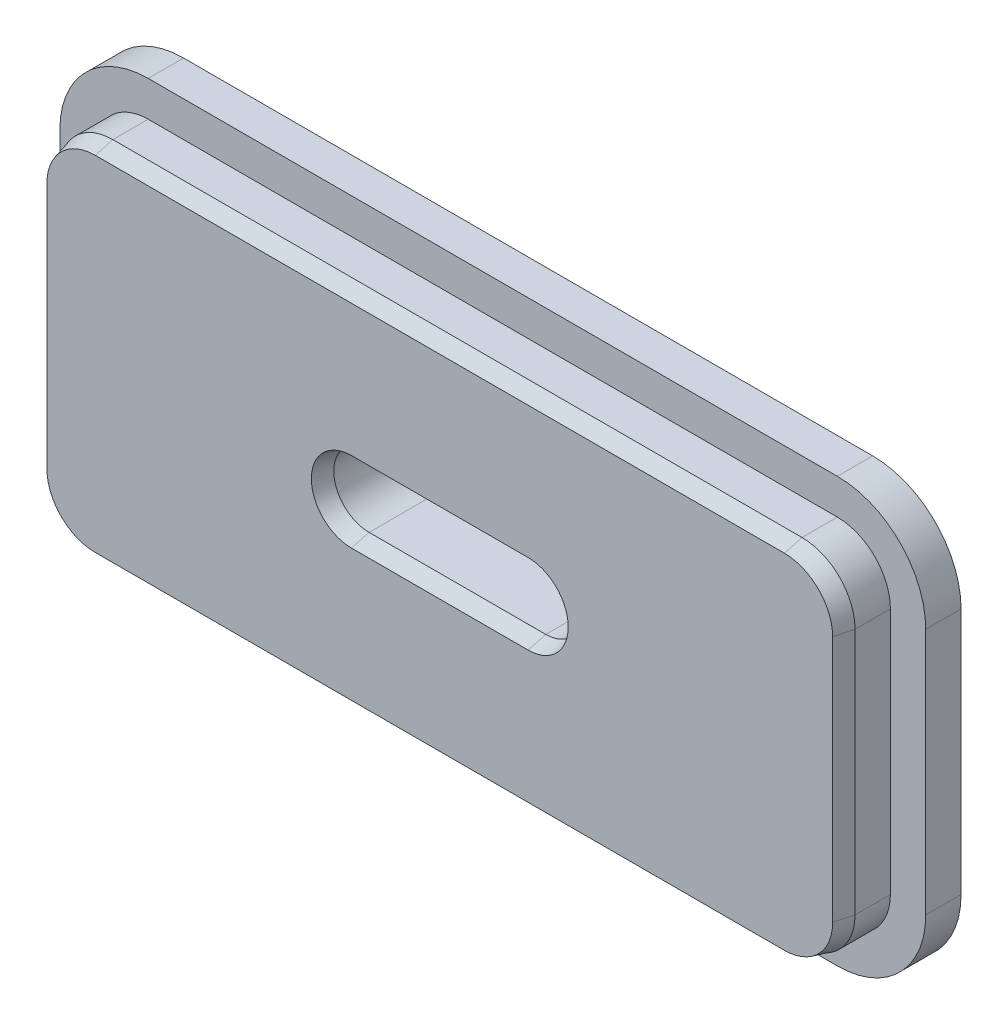
ISO-10303-21;
HEADER;
FILE_DESCRIPTION(('STEP AP214'),'2;1');
FILE_NAME('part.step','',(''),(''),'','','');
FILE_SCHEMA(('AUTOMOTIVE_DESIGN { 1 0 10303 214 1 1 1 1 }'));
ENDSEC;
DATA;
#1=APPLICATION_CONTEXT('core data for automotive mechanical design processes');
#2=APPLICATION_PROTOCOL_DEFINITION('international standard','automotive_design',2000,#1);
#3=PRODUCT_CONTEXT('',#1,'mechanical');
#4=PRODUCT('Part','Part','',(#3));
#5=PRODUCT_RELATED_PRODUCT_CATEGORY('part','',(#4));
#6=PRODUCT_DEFINITION_FORMATION('','',#4);
#7=PRODUCT_DEFINITION_CONTEXT('part definition',#1,'design');
#8=PRODUCT_DEFINITION('design','',#6,#7);
#9=PRODUCT_DEFINITION_SHAPE('','',#8);
#10=(LENGTH_UNIT() NAMED_UNIT(*) SI_UNIT(.MILLI.,.METRE.));
#11=(NAMED_UNIT(*) PLANE_ANGLE_UNIT() SI_UNIT($,.RADIAN.));
#12=(NAMED_UNIT(*) SI_UNIT($,.STERADIAN.) SOLID_ANGLE_UNIT());
#13=UNCERTAINTY_MEASURE_WITH_UNIT(LENGTH_MEASURE(1.E-05),#10,'distance_accuracy_value','');
#14=(GEOMETRIC_REPRESENTATION_CONTEXT(3) GLOBAL_UNCERTAINTY_ASSIGNED_CONTEXT((#13)) GLOBAL_UNIT_ASSIGNED_CONTEXT((#10,
#11,#12)) REPRESENTATION_CONTEXT('',''));
#15=CARTESIAN_POINT('',(0.,0.,0.));
#16=DIRECTION('',(0.,0.,1.));
#17=DIRECTION('',(1.,0.,0.));
#18=AXIS2_PLACEMENT_3D('',#15,#16,#17);
#19=CARTESIAN_POINT('',(-9.75,-3.5,2.));
#20=DIRECTION('',(0.,0.,-1.));
#21=DIRECTION('',(-1.,0.,0.));
#22=AXIS2_PLACEMENT_3D('',#19,#20,#21);
#23=CYLINDRICAL_SURFACE('',#22,1.5);
#24=CARTESIAN_POINT('',(-9.75,-3.5,1.));
#25=DIRECTION('',(0.,0.,-1.));
#26=DIRECTION('',(-1.,0.,0.));
#27=AXIS2_PLACEMENT_3D('',#24,#25,#26);
#28=CIRCLE('',#27,1.5);
#29=CARTESIAN_POINT('',(-9.75,-5.,1.));
#30=VERTEX_POINT('',#29);
#31=CARTESIAN_POINT('',(-11.25,-3.5,1.));
#32=VERTEX_POINT('',#31);
#33=EDGE_CURVE('E47',#30,#32,#28,.T.);
#34=ORIENTED_EDGE('',*,*,#33,.F.);
#35=DIRECTION('',(0.,0.,-1.));
#36=VECTOR('',#35,1.);
#37=CARTESIAN_POINT('',(-9.75,-5.,2.));
#38=LINE('',#37,#36);
#39=CARTESIAN_POINT('',(-9.75,-5.,2.));
#40=VERTEX_POINT('',#39);
#41=EDGE_CURVE('E11',#40,#30,#38,.T.);
#42=ORIENTED_EDGE('',*,*,#41,.F.);
#43=CARTESIAN_POINT('',(-9.75,-3.5,2.));
#44=DIRECTION('',(0.,0.,1.));
#45=DIRECTION('',(1.,0.,0.));
#46=AXIS2_PLACEMENT_3D('',#43,#44,#45);
#47=CIRCLE('',#46,1.5);
#48=CARTESIAN_POINT('',(-11.25,-3.5,2.));
#49=VERTEX_POINT('',#48);
#50=EDGE_CURVE('E376',#49,#40,#47,.T.);
#51=ORIENTED_EDGE('',*,*,#50,.F.);
#52=DIRECTION('',(0.,0.,-1.));
#53=VECTOR('',#52,1.);
#54=CARTESIAN_POINT('',(-11.25,-3.5,2.));
#55=LINE('',#54,#53);
#56=EDGE_CURVE('E400',#49,#32,#55,.T.);
#57=ORIENTED_EDGE('',*,*,#56,.T.);
#58=EDGE_LOOP('',(#34,#42,#51,#57));
#59=FACE_BOUND('',#58,.T.);
#60=ADVANCED_FACE('F33',(#59),#23,.T.);
#61=CARTESIAN_POINT('',(-9.75,-5.,2.));
#62=DIRECTION('',(0.,1.,0.));
#63=DIRECTION('',(-1.,0.,0.));
#64=AXIS2_PLACEMENT_3D('',#61,#62,#63);
#65=PLANE('',#64);
#66=DIRECTION('',(-1.,0.,0.));
#67=VECTOR('',#66,1.);
#68=CARTESIAN_POINT('',(9.75,-5.,1.));
#69=LINE('',#68,#67);
#70=CARTESIAN_POINT('',(9.75,-5.,1.));
#71=VERTEX_POINT('',#70);
#72=EDGE_CURVE('E53',#71,#30,#69,.T.);
#73=ORIENTED_EDGE('',*,*,#72,.F.);
#74=DIRECTION('',(0.,0.,-1.));
#75=VECTOR('',#74,1.);
#76=CARTESIAN_POINT('',(9.75,-5.,2.));
#77=LINE('',#76,#75);
#78=CARTESIAN_POINT('',(9.75,-5.,2.));
#79=VERTEX_POINT('',#78);
#80=EDGE_CURVE('E40',#79,#71,#77,.T.);
#81=ORIENTED_EDGE('',*,*,#80,.F.);
#82=DIRECTION('',(1.,0.,0.));
#83=VECTOR('',#82,1.);
#84=CARTESIAN_POINT('',(-9.75,-5.,2.));
#85=LINE('',#84,#83);
#86=EDGE_CURVE('E379',#40,#79,#85,.T.);
#87=ORIENTED_EDGE('',*,*,#86,.F.);
#88=ORIENTED_EDGE('',*,*,#41,.T.);
#89=EDGE_LOOP('',(#73,#81,#87,#88));
#90=FACE_BOUND('',#89,.T.);
#91=ADVANCED_FACE('F485',(#90),#65,.F.);
#92=CARTESIAN_POINT('',(9.75,-3.5,2.));
#93=DIRECTION('',(0.,0.,-1.));
#94=DIRECTION('',(-1.,0.,0.));
#95=AXIS2_PLACEMENT_3D('',#92,#93,#94);
#96=CYLINDRICAL_SURFACE('',#95,1.5);
#97=CARTESIAN_POINT('',(9.75,-3.5,1.));
#98=DIRECTION('',(0.,0.,-1.));
#99=DIRECTION('',(-1.,0.,0.));
#100=AXIS2_PLACEMENT_3D('',#97,#98,#99);
#101=CIRCLE('',#100,1.5);
#102=CARTESIAN_POINT('',(11.25,-3.5,1.));
#103=VERTEX_POINT('',#102);
#104=EDGE_CURVE('E419',#103,#71,#101,.T.);
#105=ORIENTED_EDGE('',*,*,#104,.F.);
#106=DIRECTION('',(0.,0.,-1.));
#107=VECTOR('',#106,1.);
#108=CARTESIAN_POINT('',(11.25,-3.5,2.));
#109=LINE('',#108,#107);
#110=CARTESIAN_POINT('',(11.25,-3.5,2.));
#111=VERTEX_POINT('',#110);
#112=EDGE_CURVE('E413',#111,#103,#109,.T.);
#113=ORIENTED_EDGE('',*,*,#112,.F.);
#114=CARTESIAN_POINT('',(9.75,-3.5,2.));
#115=DIRECTION('',(0.,0.,1.));
#116=DIRECTION('',(1.,0.,0.));
#117=AXIS2_PLACEMENT_3D('',#114,#115,#116);
#118=CIRCLE('',#117,1.5);
#119=EDGE_CURVE('E382',#79,#111,#118,.T.);
#120=ORIENTED_EDGE('',*,*,#119,.F.);
#121=ORIENTED_EDGE('',*,*,#80,.T.);
#122=EDGE_LOOP('',(#105,#113,#120,#121));
#123=FACE_BOUND('',#122,.T.);
#124=ADVANCED_FACE('F418',(#123),#96,.T.);
#125=CARTESIAN_POINT('',(11.25,3.5,2.));
#126=DIRECTION('',(-1.,0.,0.));
#127=DIRECTION('',(0.,-1.,0.));
#128=AXIS2_PLACEMENT_3D('',#125,#126,#127);
#129=PLANE('',#128);
#130=DIRECTION('',(0.,-1.,0.));
#131=VECTOR('',#130,1.);
#132=CARTESIAN_POINT('',(11.25,3.5,1.));
#133=LINE('',#132,#131);
#134=CARTESIAN_POINT('',(11.25,3.5,1.));
#135=VERTEX_POINT('',#134);
#136=EDGE_CURVE('E423',#135,#103,#133,.T.);
#137=ORIENTED_EDGE('',*,*,#136,.F.);
#138=DIRECTION('',(0.,0.,-1.));
#139=VECTOR('',#138,1.);
#140=CARTESIAN_POINT('',(11.25,3.5,2.));
#141=LINE('',#140,#139);
#142=CARTESIAN_POINT('',(11.25,3.5,2.));
#143=VERTEX_POINT('',#142);
#144=EDGE_CURVE('E410',#143,#135,#141,.T.);
#145=ORIENTED_EDGE('',*,*,#144,.F.);
#146=DIRECTION('',(0.,1.,0.));
#147=VECTOR('',#146,1.);
#148=CARTESIAN_POINT('',(11.25,3.5,2.));
#149=LINE('',#148,#147);
#150=EDGE_CURVE('E385',#111,#143,#149,.T.);
#151=ORIENTED_EDGE('',*,*,#150,.F.);
#152=ORIENTED_EDGE('',*,*,#112,.T.);
#153=EDGE_LOOP('',(#137,#145,#151,#152));
#154=FACE_BOUND('',#153,.T.);
#155=ADVANCED_FACE('F478',(#154),#129,.F.);
#156=CARTESIAN_POINT('',(9.75,3.5,2.));
#157=DIRECTION('',(0.,0.,-1.));
#158=DIRECTION('',(-1.,0.,0.));
#159=AXIS2_PLACEMENT_3D('',#156,#157,#158);
#160=CYLINDRICAL_SURFACE('',#159,1.5);
#161=CARTESIAN_POINT('',(9.75,3.5,1.));
#162=DIRECTION('',(0.,0.,-1.));
#163=DIRECTION('',(-1.,0.,0.));
#164=AXIS2_PLACEMENT_3D('',#161,#162,#163);
#165=CIRCLE('',#164,1.5);
#166=CARTESIAN_POINT('',(9.75,5.,1.));
#167=VERTEX_POINT('',#166);
#168=EDGE_CURVE('E424',#167,#135,#165,.T.);
#169=ORIENTED_EDGE('',*,*,#168,.F.);
#170=DIRECTION('',(0.,0.,-1.));
#171=VECTOR('',#170,1.);
#172=CARTESIAN_POINT('',(9.75,5.,2.));
#173=LINE('',#172,#171);
#174=CARTESIAN_POINT('',(9.75,5.,2.));
#175=VERTEX_POINT('',#174);
#176=EDGE_CURVE('E407',#175,#167,#173,.T.);
#177=ORIENTED_EDGE('',*,*,#176,.F.);
#178=CARTESIAN_POINT('',(9.75,3.5,2.));
#179=DIRECTION('',(0.,0.,1.));
#180=DIRECTION('',(-1.,0.,0.));
#181=AXIS2_PLACEMENT_3D('',#178,#179,#180);
#182=CIRCLE('',#181,1.5);
#183=EDGE_CURVE('E388',#143,#175,#182,.T.);
#184=ORIENTED_EDGE('',*,*,#183,.F.);
#185=ORIENTED_EDGE('',*,*,#144,.T.);
#186=EDGE_LOOP('',(#169,#177,#184,#185));
#187=FACE_BOUND('',#186,.T.);
#188=ADVANCED_FACE('F471',(#187),#160,.T.);
#189=CARTESIAN_POINT('',(-9.75,5.,2.));
#190=DIRECTION('',(0.,-1.,0.));
#191=DIRECTION('',(1.,0.,0.));
#192=AXIS2_PLACEMENT_3D('',#189,#190,#191);
#193=PLANE('',#192);
#194=DIRECTION('',(1.,0.,0.));
#195=VECTOR('',#194,1.);
#196=CARTESIAN_POINT('',(-9.75,5.,1.));
#197=LINE('',#196,#195);
#198=CARTESIAN_POINT('',(-9.75,5.,1.));
#199=VERTEX_POINT('',#198);
#200=EDGE_CURVE('E428',#199,#167,#197,.T.);
#201=ORIENTED_EDGE('',*,*,#200,.F.);
#202=DIRECTION('',(0.,0.,-1.));
#203=VECTOR('',#202,1.);
#204=CARTESIAN_POINT('',(-9.75,5.,2.));
#205=LINE('',#204,#203);
#206=CARTESIAN_POINT('',(-9.75,5.,2.));
#207=VERTEX_POINT('',#206);
#208=EDGE_CURVE('E404',#207,#199,#205,.T.);
#209=ORIENTED_EDGE('',*,*,#208,.F.);
#210=DIRECTION('',(-1.,0.,0.));
#211=VECTOR('',#210,1.);
#212=CARTESIAN_POINT('',(-9.75,5.,2.));
#213=LINE('',#212,#211);
#214=EDGE_CURVE('E391',#175,#207,#213,.T.);
#215=ORIENTED_EDGE('',*,*,#214,.F.);
#216=ORIENTED_EDGE('',*,*,#176,.T.);
#217=EDGE_LOOP('',(#201,#209,#215,#216));
#218=FACE_BOUND('',#217,.T.);
#219=ADVANCED_FACE('F464',(#218),#193,.F.);
#220=CARTESIAN_POINT('',(-9.75,3.5,2.));
#221=DIRECTION('',(0.,0.,-1.));
#222=DIRECTION('',(-1.,0.,0.));
#223=AXIS2_PLACEMENT_3D('',#220,#221,#222);
#224=CYLINDRICAL_SURFACE('',#223,1.5);
#225=CARTESIAN_POINT('',(-9.75,3.5,1.));
#226=DIRECTION('',(0.,0.,-1.));
#227=DIRECTION('',(-1.,0.,0.));
#228=AXIS2_PLACEMENT_3D('',#225,#226,#227);
#229=CIRCLE('',#228,1.5);
#230=CARTESIAN_POINT('',(-11.25,3.5,1.));
#231=VERTEX_POINT('',#230);
#232=EDGE_CURVE('E431',#231,#199,#229,.T.);
#233=ORIENTED_EDGE('',*,*,#232,.F.);
#234=DIRECTION('',(0.,0.,-1.));
#235=VECTOR('',#234,1.);
#236=CARTESIAN_POINT('',(-11.25,3.5,2.));
#237=LINE('',#236,#235);
#238=CARTESIAN_POINT('',(-11.25,3.5,2.));
#239=VERTEX_POINT('',#238);
#240=EDGE_CURVE('E402',#239,#231,#237,.T.);
#241=ORIENTED_EDGE('',*,*,#240,.F.);
#242=CARTESIAN_POINT('',(-9.75,3.5,2.));
#243=DIRECTION('',(0.,0.,1.));
#244=DIRECTION('',(1.,0.,0.));
#245=AXIS2_PLACEMENT_3D('',#242,#243,#244);
#246=CIRCLE('',#245,1.5);
#247=EDGE_CURVE('E394',#207,#239,#246,.T.);
#248=ORIENTED_EDGE('',*,*,#247,.F.);
#249=ORIENTED_EDGE('',*,*,#208,.T.);
#250=EDGE_LOOP('',(#233,#241,#248,#249));
#251=FACE_BOUND('',#250,.T.);
#252=ADVANCED_FACE('F457',(#251),#224,.T.);
#253=CARTESIAN_POINT('',(-11.25,3.5,2.));
#254=DIRECTION('',(1.,0.,0.));
#255=DIRECTION('',(0.,1.,0.));
#256=AXIS2_PLACEMENT_3D('',#253,#254,#255);
#257=PLANE('',#256);
#258=DIRECTION('',(0.,1.,0.));
#259=VECTOR('',#258,1.);
#260=CARTESIAN_POINT('',(-11.25,-3.5,1.));
#261=LINE('',#260,#259);
#262=EDGE_CURVE('E434',#32,#231,#261,.T.);
#263=ORIENTED_EDGE('',*,*,#262,.F.);
#264=ORIENTED_EDGE('',*,*,#56,.F.);
#265=DIRECTION('',(0.,-1.,0.));
#266=VECTOR('',#265,1.);
#267=CARTESIAN_POINT('',(-11.25,3.5,2.));
#268=LINE('',#267,#266);
#269=EDGE_CURVE('E397',#239,#49,#268,.T.);
#270=ORIENTED_EDGE('',*,*,#269,.F.);
#271=ORIENTED_EDGE('',*,*,#240,.T.);
#272=EDGE_LOOP('',(#263,#264,#270,#271));
#273=FACE_BOUND('',#272,.T.);
#274=ADVANCED_FACE('F440',(#273),#257,.F.);
#275=CARTESIAN_POINT('',(-9.75,-3.5,0.));
#276=DIRECTION('',(0.,0.,1.));
#277=DIRECTION('',(1.,0.,0.));
#278=AXIS2_PLACEMENT_3D('',#275,#276,#277);
#279=PLANE('',#278);
#280=CARTESIAN_POINT('',(-2.5,0.,0.));
#281=DIRECTION('',(0.,0.,1.));
#282=DIRECTION('',(1.,0.,0.));
#283=AXIS2_PLACEMENT_3D('',#280,#281,#282);
#284=CIRCLE('',#283,1.);
#285=CARTESIAN_POINT('',(-2.5,1.,0.));
#286=VERTEX_POINT('',#285);
#287=CARTESIAN_POINT('',(-2.5,-1.,0.));
#288=VERTEX_POINT('',#287);
#289=EDGE_CURVE('E287',#286,#288,#284,.T.);
#290=ORIENTED_EDGE('',*,*,#289,.T.);
#291=DIRECTION('',(1.,0.,0.));
#292=VECTOR('',#291,1.);
#293=CARTESIAN_POINT('',(-2.5,-1.,0.));
#294=LINE('',#293,#292);
#295=CARTESIAN_POINT('',(2.5,-1.,0.));
#296=VERTEX_POINT('',#295);
#297=EDGE_CURVE('E359',#288,#296,#294,.T.);
#298=ORIENTED_EDGE('',*,*,#297,.T.);
#299=CARTESIAN_POINT('',(2.5,0.,0.));
#300=DIRECTION('',(0.,0.,1.));
#301=DIRECTION('',(1.,0.,0.));
#302=AXIS2_PLACEMENT_3D('',#299,#300,#301);
#303=CIRCLE('',#302,1.);
#304=CARTESIAN_POINT('',(2.5,1.,0.));
#305=VERTEX_POINT('',#304);
#306=EDGE_CURVE('E362',#296,#305,#303,.T.);
#307=ORIENTED_EDGE('',*,*,#306,.T.);
#308=DIRECTION('',(-1.,0.,0.));
#309=VECTOR('',#308,1.);
#310=CARTESIAN_POINT('',(-2.5,1.,0.));
#311=LINE('',#310,#309);
#312=EDGE_CURVE('E347',#305,#286,#311,.T.);
#313=ORIENTED_EDGE('',*,*,#312,.T.);
#314=EDGE_LOOP('',(#290,#298,#307,#313));
#315=FACE_BOUND('',#314,.T.);
#316=CARTESIAN_POINT('',(-9.75,-3.5,0.));
#317=DIRECTION('',(0.,0.,-1.));
#318=DIRECTION('',(-1.,0.,0.));
#319=AXIS2_PLACEMENT_3D('',#316,#317,#318);
#320=CIRCLE('',#319,2.5);
#321=CARTESIAN_POINT('',(-9.75,-6.,0.));
#322=VERTEX_POINT('',#321);
#323=CARTESIAN_POINT('',(-12.25,-3.5,0.));
#324=VERTEX_POINT('',#323);
#325=EDGE_CURVE('E254',#322,#324,#320,.T.);
#326=ORIENTED_EDGE('',*,*,#325,.T.);
#327=DIRECTION('',(0.,1.,0.));
#328=VECTOR('',#327,1.);
#329=CARTESIAN_POINT('',(-12.25,-3.5,0.));
#330=LINE('',#329,#328);
#331=CARTESIAN_POINT('',(-12.25,3.5,0.));
#332=VERTEX_POINT('',#331);
#333=EDGE_CURVE('E211',#324,#332,#330,.T.);
#334=ORIENTED_EDGE('',*,*,#333,.T.);
#335=CARTESIAN_POINT('',(-9.75,3.5,0.));
#336=DIRECTION('',(0.,0.,-1.));
#337=DIRECTION('',(-1.,0.,0.));
#338=AXIS2_PLACEMENT_3D('',#335,#336,#337);
#339=CIRCLE('',#338,2.5);
#340=CARTESIAN_POINT('',(-9.75,6.,0.));
#341=VERTEX_POINT('',#340);
#342=EDGE_CURVE('E257',#332,#341,#339,.T.);
#343=ORIENTED_EDGE('',*,*,#342,.T.);
#344=DIRECTION('',(1.,0.,0.));
#345=VECTOR('',#344,1.);
#346=CARTESIAN_POINT('',(-9.75,6.,0.));
#347=LINE('',#346,#345);
#348=CARTESIAN_POINT('',(9.75,6.,0.));
#349=VERTEX_POINT('',#348);
#350=EDGE_CURVE('E260',#341,#349,#347,.T.);
#351=ORIENTED_EDGE('',*,*,#350,.T.);
#352=CARTESIAN_POINT('',(9.75,3.5,0.));
#353=DIRECTION('',(0.,0.,-1.));
#354=DIRECTION('',(-1.,0.,0.));
#355=AXIS2_PLACEMENT_3D('',#352,#353,#354);
#356=CIRCLE('',#355,2.5);
#357=CARTESIAN_POINT('',(12.25,3.5,0.));
#358=VERTEX_POINT('',#357);
#359=EDGE_CURVE('E263',#349,#358,#356,.T.);
#360=ORIENTED_EDGE('',*,*,#359,.T.);
#361=DIRECTION('',(0.,-1.,0.));
#362=VECTOR('',#361,1.);
#363=CARTESIAN_POINT('',(12.25,3.5,0.));
#364=LINE('',#363,#362);
#365=CARTESIAN_POINT('',(12.25,-3.5,0.));
#366=VERTEX_POINT('',#365);
#367=EDGE_CURVE('E266',#358,#366,#364,.T.);
#368=ORIENTED_EDGE('',*,*,#367,.T.);
#369=CARTESIAN_POINT('',(9.75,-3.5,0.));
#370=DIRECTION('',(0.,0.,-1.));
#371=DIRECTION('',(-1.,0.,0.));
#372=AXIS2_PLACEMENT_3D('',#369,#370,#371);
#373=CIRCLE('',#372,2.5);
#374=CARTESIAN_POINT('',(9.75,-6.,0.));
#375=VERTEX_POINT('',#374);
#376=EDGE_CURVE('E235',#366,#375,#373,.T.);
#377=ORIENTED_EDGE('',*,*,#376,.T.);
#378=DIRECTION('',(-1.,0.,0.));
#379=VECTOR('',#378,1.);
#380=CARTESIAN_POINT('',(9.75,-6.,0.));
#381=LINE('',#380,#379);
#382=EDGE_CURVE('E232',#375,#322,#381,.T.);
#383=ORIENTED_EDGE('',*,*,#382,.T.);
#384=EDGE_LOOP('',(#326,#334,#343,#351,#360,#368,#377,#383));
#385=FACE_BOUND('',#384,.T.);
#386=ADVANCED_FACE('F503',(#315,#385),#279,.F.);
#387=CARTESIAN_POINT('',(-2.5,0.,2.));
#388=DIRECTION('',(0.,0.,-1.));
#389=DIRECTION('',(-1.,0.,0.));
#390=AXIS2_PLACEMENT_3D('',#387,#388,#389);
#391=CYLINDRICAL_SURFACE('',#390,1.);
#392=ORIENTED_EDGE('',*,*,#289,.F.);
#393=DIRECTION('',(0.,0.,-1.));
#394=VECTOR('',#393,1.);
#395=CARTESIAN_POINT('',(-2.5,1.,2.));
#396=LINE('',#395,#394);
#397=CARTESIAN_POINT('',(-2.5,1.,2.));
#398=VERTEX_POINT('',#397);
#399=EDGE_CURVE('E356',#398,#286,#396,.T.);
#400=ORIENTED_EDGE('',*,*,#399,.F.);
#401=CARTESIAN_POINT('',(-2.5,0.,2.));
#402=DIRECTION('',(0.,0.,1.));
#403=DIRECTION('',(1.,0.,0.));
#404=AXIS2_PLACEMENT_3D('',#401,#402,#403);
#405=CIRCLE('',#404,1.);
#406=CARTESIAN_POINT('',(-2.5,-1.,2.));
#407=VERTEX_POINT('',#406);
#408=EDGE_CURVE('E343',#398,#407,#405,.T.);
#409=ORIENTED_EDGE('',*,*,#408,.T.);
#410=DIRECTION('',(0.,0.,-1.));
#411=VECTOR('',#410,1.);
#412=CARTESIAN_POINT('',(-2.5,-1.,2.));
#413=LINE('',#412,#411);
#414=EDGE_CURVE('E373',#407,#288,#413,.T.);
#415=ORIENTED_EDGE('',*,*,#414,.T.);
#416=EDGE_LOOP('',(#392,#400,#409,#415));
#417=FACE_BOUND('',#416,.T.);
#418=ADVANCED_FACE('F506',(#417),#391,.F.);
#419=CARTESIAN_POINT('',(-2.5,-1.,2.));
#420=DIRECTION('',(0.,1.,0.));
#421=DIRECTION('',(0.,0.,1.));
#422=AXIS2_PLACEMENT_3D('',#419,#420,#421);
#423=PLANE('',#422);
#424=ORIENTED_EDGE('',*,*,#297,.F.);
#425=ORIENTED_EDGE('',*,*,#414,.F.);
#426=DIRECTION('',(1.,0.,0.));
#427=VECTOR('',#426,1.);
#428=CARTESIAN_POINT('',(-2.5,-1.,2.));
#429=LINE('',#428,#427);
#430=CARTESIAN_POINT('',(2.5,-1.,2.));
#431=VERTEX_POINT('',#430);
#432=EDGE_CURVE('E346',#407,#431,#429,.T.);
#433=ORIENTED_EDGE('',*,*,#432,.T.);
#434=DIRECTION('',(0.,0.,-1.));
#435=VECTOR('',#434,1.);
#436=CARTESIAN_POINT('',(2.5,-1.,2.));
#437=LINE('',#436,#435);
#438=EDGE_CURVE('E371',#431,#296,#437,.T.);
#439=ORIENTED_EDGE('',*,*,#438,.T.);
#440=EDGE_LOOP('',(#424,#425,#433,#439));
#441=FACE_BOUND('',#440,.T.);
#442=ADVANCED_FACE('F510',(#441),#423,.T.);
#443=CARTESIAN_POINT('',(2.5,0.,2.));
#444=DIRECTION('',(0.,0.,-1.));
#445=DIRECTION('',(-1.,0.,0.));
#446=AXIS2_PLACEMENT_3D('',#443,#444,#445);
#447=CYLINDRICAL_SURFACE('',#446,1.);
#448=ORIENTED_EDGE('',*,*,#306,.F.);
#449=ORIENTED_EDGE('',*,*,#438,.F.);
#450=CARTESIAN_POINT('',(2.5,0.,2.));
#451=DIRECTION('',(0.,0.,1.));
#452=DIRECTION('',(1.,0.,0.));
#453=AXIS2_PLACEMENT_3D('',#450,#451,#452);
#454=CIRCLE('',#453,1.);
#455=CARTESIAN_POINT('',(2.5,1.,2.));
#456=VERTEX_POINT('',#455);
#457=EDGE_CURVE('E350',#431,#456,#454,.T.);
#458=ORIENTED_EDGE('',*,*,#457,.T.);
#459=DIRECTION('',(0.,0.,-1.));
#460=VECTOR('',#459,1.);
#461=CARTESIAN_POINT('',(2.5,1.,2.));
#462=LINE('',#461,#460);
#463=EDGE_CURVE('E369',#456,#305,#462,.T.);
#464=ORIENTED_EDGE('',*,*,#463,.T.);
#465=EDGE_LOOP('',(#448,#449,#458,#464));
#466=FACE_BOUND('',#465,.T.);
#467=ADVANCED_FACE('F514',(#466),#447,.F.);
#468=CARTESIAN_POINT('',(-2.5,1.,2.));
#469=DIRECTION('',(0.,-1.,0.));
#470=DIRECTION('',(1.,0.,0.));
#471=AXIS2_PLACEMENT_3D('',#468,#469,#470);
#472=PLANE('',#471);
#473=ORIENTED_EDGE('',*,*,#312,.F.);
#474=ORIENTED_EDGE('',*,*,#463,.F.);
#475=DIRECTION('',(-1.,0.,0.));
#476=VECTOR('',#475,1.);
#477=CARTESIAN_POINT('',(-2.5,1.,2.));
#478=LINE('',#477,#476);
#479=EDGE_CURVE('E353',#456,#398,#478,.T.);
#480=ORIENTED_EDGE('',*,*,#479,.T.);
#481=ORIENTED_EDGE('',*,*,#399,.T.);
#482=EDGE_LOOP('',(#473,#474,#480,#481));
#483=FACE_BOUND('',#482,.T.);
#484=ADVANCED_FACE('F518',(#483),#472,.T.);
#485=CARTESIAN_POINT('',(-9.75,-3.5,2.5));
#486=DIRECTION('',(0.,0.,1.));
#487=DIRECTION('',(1.,0.,0.));
#488=AXIS2_PLACEMENT_3D('',#485,#486,#487);
#489=PLANE('',#488);
#490=CARTESIAN_POINT('',(-9.75,-3.5,2.5));
#491=DIRECTION('',(0.,0.,1.));
#492=DIRECTION('',(1.,0.,0.));
#493=AXIS2_PLACEMENT_3D('',#490,#491,#492);
#494=CIRCLE('',#493,1.36602540378444);
#495=CARTESIAN_POINT('',(-11.1160254037844,-3.5,2.5));
#496=VERTEX_POINT('',#495);
#497=CARTESIAN_POINT('',(-9.75,-4.86602540378444,2.5));
#498=VERTEX_POINT('',#497);
#499=EDGE_CURVE('E310',#496,#498,#494,.T.);
#500=ORIENTED_EDGE('',*,*,#499,.T.);
#501=DIRECTION('',(-1.,0.,0.));
#502=VECTOR('',#501,1.);
#503=CARTESIAN_POINT('',(-9.75,-4.86602540378444,2.5));
#504=LINE('',#503,#502);
#505=CARTESIAN_POINT('',(9.75,-4.86602540378444,2.5));
#506=VERTEX_POINT('',#505);
#507=EDGE_CURVE('E313',#498,#506,#504,.F.);
#508=ORIENTED_EDGE('',*,*,#507,.T.);
#509=CARTESIAN_POINT('',(9.75,-3.5,2.5));
#510=DIRECTION('',(0.,0.,1.));
#511=DIRECTION('',(1.,0.,0.));
#512=AXIS2_PLACEMENT_3D('',#509,#510,#511);
#513=CIRCLE('',#512,1.36602540378444);
#514=CARTESIAN_POINT('',(11.1160254037844,-3.5,2.5));
#515=VERTEX_POINT('',#514);
#516=EDGE_CURVE('E316',#506,#515,#513,.T.);
#517=ORIENTED_EDGE('',*,*,#516,.T.);
#518=DIRECTION('',(0.,-1.,0.));
#519=VECTOR('',#518,1.);
#520=CARTESIAN_POINT('',(11.1160254037844,-3.5,2.5));
#521=LINE('',#520,#519);
#522=CARTESIAN_POINT('',(11.1160254037844,3.5,2.5));
#523=VERTEX_POINT('',#522);
#524=EDGE_CURVE('E318',#515,#523,#521,.F.);
#525=ORIENTED_EDGE('',*,*,#524,.T.);
#526=CARTESIAN_POINT('',(9.75,3.5,2.5));
#527=DIRECTION('',(0.,0.,1.));
#528=DIRECTION('',(1.,0.,0.));
#529=AXIS2_PLACEMENT_3D('',#526,#527,#528);
#530=CIRCLE('',#529,1.36602540378444);
#531=CARTESIAN_POINT('',(9.75,4.86602540378444,2.5));
#532=VERTEX_POINT('',#531);
#533=EDGE_CURVE('E320',#523,#532,#530,.T.);
#534=ORIENTED_EDGE('',*,*,#533,.T.);
#535=DIRECTION('',(1.,0.,0.));
#536=VECTOR('',#535,1.);
#537=CARTESIAN_POINT('',(9.75,4.86602540378444,2.5));
#538=LINE('',#537,#536);
#539=CARTESIAN_POINT('',(-9.75,4.86602540378444,2.5));
#540=VERTEX_POINT('',#539);
#541=EDGE_CURVE('E322',#532,#540,#538,.F.);
#542=ORIENTED_EDGE('',*,*,#541,.T.);
#543=CARTESIAN_POINT('',(-9.75,3.5,2.5));
#544=DIRECTION('',(0.,0.,1.));
#545=DIRECTION('',(1.,0.,0.));
#546=AXIS2_PLACEMENT_3D('',#543,#544,#545);
#547=CIRCLE('',#546,1.36602540378444);
#548=CARTESIAN_POINT('',(-11.1160254037844,3.5,2.5));
#549=VERTEX_POINT('',#548);
#550=EDGE_CURVE('E324',#540,#549,#547,.T.);
#551=ORIENTED_EDGE('',*,*,#550,.T.);
#552=DIRECTION('',(0.,1.,0.));
#553=VECTOR('',#552,1.);
#554=CARTESIAN_POINT('',(-11.1160254037844,3.5,2.5));
#555=LINE('',#554,#553);
#556=EDGE_CURVE('E293',#549,#496,#555,.F.);
#557=ORIENTED_EDGE('',*,*,#556,.T.);
#558=EDGE_LOOP('',(#500,#508,#517,#525,#534,#542,#551,#557));
#559=FACE_BOUND('',#558,.T.);
#560=DIRECTION('',(-1.,0.,0.));
#561=VECTOR('',#560,1.);
#562=CARTESIAN_POINT('',(2.5,1.13397459621556,2.5));
#563=LINE('',#562,#561);
#564=CARTESIAN_POINT('',(2.5,1.13397459621556,2.5));
#565=VERTEX_POINT('',#564);
#566=CARTESIAN_POINT('',(-2.5,1.13397459621556,2.5));
#567=VERTEX_POINT('',#566);
#568=EDGE_CURVE('E337',#565,#567,#563,.T.);
#569=ORIENTED_EDGE('',*,*,#568,.F.);
#570=CARTESIAN_POINT('',(2.5,0.,2.5));
#571=DIRECTION('',(0.,0.,1.));
#572=DIRECTION('',(1.,0.,0.));
#573=AXIS2_PLACEMENT_3D('',#570,#571,#572);
#574=CIRCLE('',#573,1.13397459621556);
#575=CARTESIAN_POINT('',(2.5,-1.13397459621556,2.5));
#576=VERTEX_POINT('',#575);
#577=EDGE_CURVE('E272',#576,#565,#574,.T.);
#578=ORIENTED_EDGE('',*,*,#577,.F.);
#579=DIRECTION('',(1.,0.,0.));
#580=VECTOR('',#579,1.);
#581=CARTESIAN_POINT('',(-2.5,-1.13397459621556,2.5));
#582=LINE('',#581,#580);
#583=CARTESIAN_POINT('',(-2.5,-1.13397459621556,2.5));
#584=VERTEX_POINT('',#583);
#585=EDGE_CURVE('E331',#584,#576,#582,.T.);
#586=ORIENTED_EDGE('',*,*,#585,.F.);
#587=CARTESIAN_POINT('',(-2.5,0.,2.5));
#588=DIRECTION('',(0.,0.,1.));
#589=DIRECTION('',(1.,0.,0.));
#590=AXIS2_PLACEMENT_3D('',#587,#588,#589);
#591=CIRCLE('',#590,1.13397459621556);
#592=EDGE_CURVE('E339',#567,#584,#591,.T.);
#593=ORIENTED_EDGE('',*,*,#592,.F.);
#594=EDGE_LOOP('',(#569,#578,#586,#593));
#595=FACE_BOUND('',#594,.T.);
#596=ADVANCED_FACE('F522',(#559,#595),#489,.T.);
#597=CARTESIAN_POINT('',(-9.75,-3.5,2.));
#598=DIRECTION('',(0.,0.,-1.));
#599=DIRECTION('',(1.,0.,0.));
#600=AXIS2_PLACEMENT_3D('',#597,#598,#599);
#601=CONICAL_SURFACE('',#600,1.5,0.26179938779915);
#602=ORIENTED_EDGE('',*,*,#50,.T.);
#603=DIRECTION('',(0.,-0.258819045102521,-0.965925826289068));
#604=VECTOR('',#603,1.);
#605=CARTESIAN_POINT('',(-9.75,-5.,2.));
#606=LINE('',#605,#604);
#607=EDGE_CURVE('E284',#498,#40,#606,.T.);
#608=ORIENTED_EDGE('',*,*,#607,.F.);
#609=ORIENTED_EDGE('',*,*,#499,.F.);
#610=DIRECTION('',(-0.258819045102521,0.,-0.965925826289068));
#611=VECTOR('',#610,1.);
#612=CARTESIAN_POINT('',(-11.25,-3.5,2.));
#613=LINE('',#612,#611);
#614=EDGE_CURVE('E289',#496,#49,#613,.T.);
#615=ORIENTED_EDGE('',*,*,#614,.T.);
#616=EDGE_LOOP('',(#602,#608,#609,#615));
#617=FACE_BOUND('',#616,.T.);
#618=ADVANCED_FACE('F444',(#617),#601,.T.);
#619=CARTESIAN_POINT('',(-9.75,-5.,2.));
#620=DIRECTION('',(0.,-0.965925826289068,0.258819045102521));
#621=DIRECTION('',(0.,-0.258819045102521,-0.965925826289068));
#622=AXIS2_PLACEMENT_3D('',#619,#620,#621);
#623=PLANE('',#622);
#624=ORIENTED_EDGE('',*,*,#86,.T.);
#625=DIRECTION('',(0.,-0.258819045102521,-0.965925826289068));
#626=VECTOR('',#625,1.);
#627=CARTESIAN_POINT('',(9.75,-5.,2.));
#628=LINE('',#627,#626);
#629=EDGE_CURVE('E288',#506,#79,#628,.T.);
#630=ORIENTED_EDGE('',*,*,#629,.F.);
#631=ORIENTED_EDGE('',*,*,#507,.F.);
#632=ORIENTED_EDGE('',*,*,#607,.T.);
#633=EDGE_LOOP('',(#624,#630,#631,#632));
#634=FACE_BOUND('',#633,.T.);
#635=ADVANCED_FACE('F484',(#634),#623,.T.);
#636=CARTESIAN_POINT('',(9.75,-3.5,2.));
#637=DIRECTION('',(0.,0.,-1.));
#638=DIRECTION('',(1.,0.,0.));
#639=AXIS2_PLACEMENT_3D('',#636,#637,#638);
#640=CONICAL_SURFACE('',#639,1.5,0.26179938779915);
#641=ORIENTED_EDGE('',*,*,#119,.T.);
#642=DIRECTION('',(0.258819045102521,0.,-0.965925826289068));
#643=VECTOR('',#642,1.);
#644=CARTESIAN_POINT('',(11.25,-3.5,2.));
#645=LINE('',#644,#643);
#646=EDGE_CURVE('E305',#515,#111,#645,.T.);
#647=ORIENTED_EDGE('',*,*,#646,.F.);
#648=ORIENTED_EDGE('',*,*,#516,.F.);
#649=ORIENTED_EDGE('',*,*,#629,.T.);
#650=EDGE_LOOP('',(#641,#647,#648,#649));
#651=FACE_BOUND('',#650,.T.);
#652=ADVANCED_FACE('F480',(#651),#640,.T.);
#653=CARTESIAN_POINT('',(11.25,-3.5,2.));
#654=DIRECTION('',(0.965925826289068,0.,0.258819045102521));
#655=DIRECTION('',(0.258819045102521,0.,-0.965925826289068));
#656=AXIS2_PLACEMENT_3D('',#653,#654,#655);
#657=PLANE('',#656);
#658=ORIENTED_EDGE('',*,*,#150,.T.);
#659=DIRECTION('',(0.258819045102521,0.,-0.965925826289068));
#660=VECTOR('',#659,1.);
#661=CARTESIAN_POINT('',(11.25,3.5,2.));
#662=LINE('',#661,#660);
#663=EDGE_CURVE('E302',#523,#143,#662,.T.);
#664=ORIENTED_EDGE('',*,*,#663,.F.);
#665=ORIENTED_EDGE('',*,*,#524,.F.);
#666=ORIENTED_EDGE('',*,*,#646,.T.);
#667=EDGE_LOOP('',(#658,#664,#665,#666));
#668=FACE_BOUND('',#667,.T.);
#669=ADVANCED_FACE('F474',(#668),#657,.T.);
#670=CARTESIAN_POINT('',(9.75,3.5,2.));
#671=DIRECTION('',(0.,0.,-1.));
#672=DIRECTION('',(1.,0.,0.));
#673=AXIS2_PLACEMENT_3D('',#670,#671,#672);
#674=CONICAL_SURFACE('',#673,1.5,0.26179938779915);
#675=ORIENTED_EDGE('',*,*,#183,.T.);
#676=DIRECTION('',(0.,0.258819045102521,-0.965925826289068));
#677=VECTOR('',#676,1.);
#678=CARTESIAN_POINT('',(9.75,5.,2.));
#679=LINE('',#678,#677);
#680=EDGE_CURVE('E299',#532,#175,#679,.T.);
#681=ORIENTED_EDGE('',*,*,#680,.F.);
#682=ORIENTED_EDGE('',*,*,#533,.F.);
#683=ORIENTED_EDGE('',*,*,#663,.T.);
#684=EDGE_LOOP('',(#675,#681,#682,#683));
#685=FACE_BOUND('',#684,.T.);
#686=ADVANCED_FACE('F467',(#685),#674,.T.);
#687=CARTESIAN_POINT('',(9.75,5.,2.));
#688=DIRECTION('',(0.,0.965925826289068,0.258819045102521));
#689=DIRECTION('',(0.,-0.258819045102521,0.965925826289068));
#690=AXIS2_PLACEMENT_3D('',#687,#688,#689);
#691=PLANE('',#690);
#692=ORIENTED_EDGE('',*,*,#214,.T.);
#693=DIRECTION('',(0.,0.258819045102521,-0.965925826289068));
#694=VECTOR('',#693,1.);
#695=CARTESIAN_POINT('',(-9.75,5.,2.));
#696=LINE('',#695,#694);
#697=EDGE_CURVE('E296',#540,#207,#696,.T.);
#698=ORIENTED_EDGE('',*,*,#697,.F.);
#699=ORIENTED_EDGE('',*,*,#541,.F.);
#700=ORIENTED_EDGE('',*,*,#680,.T.);
#701=EDGE_LOOP('',(#692,#698,#699,#700));
#702=FACE_BOUND('',#701,.T.);
#703=ADVANCED_FACE('F460',(#702),#691,.T.);
#704=CARTESIAN_POINT('',(-9.75,3.5,2.));
#705=DIRECTION('',(0.,0.,-1.));
#706=DIRECTION('',(1.,0.,0.));
#707=AXIS2_PLACEMENT_3D('',#704,#705,#706);
#708=CONICAL_SURFACE('',#707,1.5,0.26179938779915);
#709=ORIENTED_EDGE('',*,*,#247,.T.);
#710=DIRECTION('',(-0.258819045102521,0.,-0.965925826289068));
#711=VECTOR('',#710,1.);
#712=CARTESIAN_POINT('',(-11.25,3.5,2.));
#713=LINE('',#712,#711);
#714=EDGE_CURVE('E292',#549,#239,#713,.T.);
#715=ORIENTED_EDGE('',*,*,#714,.F.);
#716=ORIENTED_EDGE('',*,*,#550,.F.);
#717=ORIENTED_EDGE('',*,*,#697,.T.);
#718=EDGE_LOOP('',(#709,#715,#716,#717));
#719=FACE_BOUND('',#718,.T.);
#720=ADVANCED_FACE('F453',(#719),#708,.T.);
#721=CARTESIAN_POINT('',(-11.25,3.5,2.));
#722=DIRECTION('',(-0.965925826289068,0.,0.258819045102521));
#723=DIRECTION('',(0.258819045102521,0.,0.965925826289068));
#724=AXIS2_PLACEMENT_3D('',#721,#722,#723);
#725=PLANE('',#724);
#726=ORIENTED_EDGE('',*,*,#269,.T.);
#727=ORIENTED_EDGE('',*,*,#614,.F.);
#728=ORIENTED_EDGE('',*,*,#556,.F.);
#729=ORIENTED_EDGE('',*,*,#714,.T.);
#730=EDGE_LOOP('',(#726,#727,#728,#729));
#731=FACE_BOUND('',#730,.T.);
#732=ADVANCED_FACE('F449',(#731),#725,.T.);
#733=CARTESIAN_POINT('',(2.5,0.,2.));
#734=DIRECTION('',(0.,0.,1.));
#735=DIRECTION('',(1.,0.,0.));
#736=AXIS2_PLACEMENT_3D('',#733,#734,#735);
#737=CONICAL_SURFACE('',#736,1.,0.26179938779915);
#738=ORIENTED_EDGE('',*,*,#457,.F.);
#739=DIRECTION('',(0.,0.258819045102521,-0.965925826289068));
#740=VECTOR('',#739,1.);
#741=CARTESIAN_POINT('',(2.5,-1.,2.));
#742=LINE('',#741,#740);
#743=EDGE_CURVE('E327',#576,#431,#742,.T.);
#744=ORIENTED_EDGE('',*,*,#743,.F.);
#745=ORIENTED_EDGE('',*,*,#577,.T.);
#746=DIRECTION('',(0.,-0.258819045102521,-0.965925826289068));
#747=VECTOR('',#746,1.);
#748=CARTESIAN_POINT('',(2.5,1.,2.));
#749=LINE('',#748,#747);
#750=EDGE_CURVE('E314',#565,#456,#749,.T.);
#751=ORIENTED_EDGE('',*,*,#750,.T.);
#752=EDGE_LOOP('',(#738,#744,#745,#751));
#753=FACE_BOUND('',#752,.T.);
#754=ADVANCED_FACE('F535',(#753),#737,.F.);
#755=CARTESIAN_POINT('',(2.5,1.,2.));
#756=DIRECTION('',(0.,-0.965925826289068,0.258819045102521));
#757=DIRECTION('',(0.,-0.258819045102521,-0.965925826289068));
#758=AXIS2_PLACEMENT_3D('',#755,#756,#757);
#759=PLANE('',#758);
#760=ORIENTED_EDGE('',*,*,#479,.F.);
#761=ORIENTED_EDGE('',*,*,#750,.F.);
#762=ORIENTED_EDGE('',*,*,#568,.T.);
#763=DIRECTION('',(0.,-0.258819045102521,-0.965925826289068));
#764=VECTOR('',#763,1.);
#765=CARTESIAN_POINT('',(-2.5,1.,2.));
#766=LINE('',#765,#764);
#767=EDGE_CURVE('E333',#567,#398,#766,.T.);
#768=ORIENTED_EDGE('',*,*,#767,.T.);
#769=EDGE_LOOP('',(#760,#761,#762,#768));
#770=FACE_BOUND('',#769,.T.);
#771=ADVANCED_FACE('F531',(#770),#759,.T.);
#772=CARTESIAN_POINT('',(-2.5,0.,2.));
#773=DIRECTION('',(0.,0.,1.));
#774=DIRECTION('',(1.,0.,0.));
#775=AXIS2_PLACEMENT_3D('',#772,#773,#774);
#776=CONICAL_SURFACE('',#775,1.,0.26179938779915);
#777=ORIENTED_EDGE('',*,*,#408,.F.);
#778=ORIENTED_EDGE('',*,*,#767,.F.);
#779=ORIENTED_EDGE('',*,*,#592,.T.);
#780=DIRECTION('',(0.,0.258819045102521,-0.965925826289068));
#781=VECTOR('',#780,1.);
#782=CARTESIAN_POINT('',(-2.5,-1.,2.));
#783=LINE('',#782,#781);
#784=EDGE_CURVE('E330',#584,#407,#783,.T.);
#785=ORIENTED_EDGE('',*,*,#784,.T.);
#786=EDGE_LOOP('',(#777,#778,#779,#785));
#787=FACE_BOUND('',#786,.T.);
#788=ADVANCED_FACE('F527',(#787),#776,.F.);
#789=CARTESIAN_POINT('',(-2.5,-1.,2.));
#790=DIRECTION('',(0.,0.965925826289068,0.258819045102521));
#791=DIRECTION('',(0.,-0.258819045102521,0.965925826289068));
#792=AXIS2_PLACEMENT_3D('',#789,#790,#791);
#793=PLANE('',#792);
#794=ORIENTED_EDGE('',*,*,#432,.F.);
#795=ORIENTED_EDGE('',*,*,#784,.F.);
#796=ORIENTED_EDGE('',*,*,#585,.T.);
#797=ORIENTED_EDGE('',*,*,#743,.T.);
#798=EDGE_LOOP('',(#794,#795,#796,#797));
#799=FACE_BOUND('',#798,.T.);
#800=ADVANCED_FACE('F524',(#799),#793,.T.);
#801=CARTESIAN_POINT('',(-9.75,-3.5,1.));
#802=DIRECTION('',(0.,0.,-1.));
#803=DIRECTION('',(-1.,0.,0.));
#804=AXIS2_PLACEMENT_3D('',#801,#802,#803);
#805=CYLINDRICAL_SURFACE('',#804,2.5);
#806=ORIENTED_EDGE('',*,*,#325,.F.);
#807=DIRECTION('',(0.,0.,-1.));
#808=VECTOR('',#807,1.);
#809=CARTESIAN_POINT('',(-9.75,-6.,1.));
#810=LINE('',#809,#808);
#811=CARTESIAN_POINT('',(-9.75,-6.,1.));
#812=VERTEX_POINT('',#811);
#813=EDGE_CURVE('E231',#812,#322,#810,.T.);
#814=ORIENTED_EDGE('',*,*,#813,.F.);
#815=CARTESIAN_POINT('',(-9.75,-3.5,1.));
#816=DIRECTION('',(0.,0.,-1.));
#817=DIRECTION('',(-1.,0.,0.));
#818=AXIS2_PLACEMENT_3D('',#815,#816,#817);
#819=CIRCLE('',#818,2.5);
#820=CARTESIAN_POINT('',(-12.25,-3.5,1.));
#821=VERTEX_POINT('',#820);
#822=EDGE_CURVE('E224',#812,#821,#819,.T.);
#823=ORIENTED_EDGE('',*,*,#822,.T.);
#824=DIRECTION('',(0.,0.,-1.));
#825=VECTOR('',#824,1.);
#826=CARTESIAN_POINT('',(-12.25,-3.5,1.));
#827=LINE('',#826,#825);
#828=EDGE_CURVE('E206',#821,#324,#827,.T.);
#829=ORIENTED_EDGE('',*,*,#828,.T.);
#830=EDGE_LOOP('',(#806,#814,#823,#829));
#831=FACE_BOUND('',#830,.T.);
#832=ADVANCED_FACE('F230',(#831),#805,.T.);
#833=CARTESIAN_POINT('',(9.75,-6.,1.));
#834=DIRECTION('',(0.,-1.,0.));
#835=DIRECTION('',(1.,0.,0.));
#836=AXIS2_PLACEMENT_3D('',#833,#834,#835);
#837=PLANE('',#836);
#838=ORIENTED_EDGE('',*,*,#382,.F.);
#839=DIRECTION('',(0.,0.,-1.));
#840=VECTOR('',#839,1.);
#841=CARTESIAN_POINT('',(9.75,-6.,1.));
#842=LINE('',#841,#840);
#843=CARTESIAN_POINT('',(9.75,-6.,1.));
#844=VERTEX_POINT('',#843);
#845=EDGE_CURVE('E273',#844,#375,#842,.T.);
#846=ORIENTED_EDGE('',*,*,#845,.F.);
#847=DIRECTION('',(-1.,0.,0.));
#848=VECTOR('',#847,1.);
#849=CARTESIAN_POINT('',(9.75,-6.,1.));
#850=LINE('',#849,#848);
#851=EDGE_CURVE('E217',#844,#812,#850,.T.);
#852=ORIENTED_EDGE('',*,*,#851,.T.);
#853=ORIENTED_EDGE('',*,*,#813,.T.);
#854=EDGE_LOOP('',(#838,#846,#852,#853));
#855=FACE_BOUND('',#854,.T.);
#856=ADVANCED_FACE('F561',(#855),#837,.T.);
#857=CARTESIAN_POINT('',(9.75,-3.5,1.));
#858=DIRECTION('',(0.,0.,-1.));
#859=DIRECTION('',(-1.,0.,0.));
#860=AXIS2_PLACEMENT_3D('',#857,#858,#859);
#861=CYLINDRICAL_SURFACE('',#860,2.5);
#862=ORIENTED_EDGE('',*,*,#376,.F.);
#863=DIRECTION('',(0.,0.,-1.));
#864=VECTOR('',#863,1.);
#865=CARTESIAN_POINT('',(12.25,-3.5,1.));
#866=LINE('',#865,#864);
#867=CARTESIAN_POINT('',(12.25,-3.5,1.));
#868=VERTEX_POINT('',#867);
#869=EDGE_CURVE('E275',#868,#366,#866,.T.);
#870=ORIENTED_EDGE('',*,*,#869,.F.);
#871=CARTESIAN_POINT('',(9.75,-3.5,1.));
#872=DIRECTION('',(0.,0.,-1.));
#873=DIRECTION('',(-1.,0.,0.));
#874=AXIS2_PLACEMENT_3D('',#871,#872,#873);
#875=CIRCLE('',#874,2.5);
#876=EDGE_CURVE('E250',#868,#844,#875,.T.);
#877=ORIENTED_EDGE('',*,*,#876,.T.);
#878=ORIENTED_EDGE('',*,*,#845,.T.);
#879=EDGE_LOOP('',(#862,#870,#877,#878));
#880=FACE_BOUND('',#879,.T.);
#881=ADVANCED_FACE('F579',(#880),#861,.T.);
#882=CARTESIAN_POINT('',(12.25,3.5,1.));
#883=DIRECTION('',(1.,0.,0.));
#884=DIRECTION('',(0.,0.,-1.));
#885=AXIS2_PLACEMENT_3D('',#882,#883,#884);
#886=PLANE('',#885);
#887=ORIENTED_EDGE('',*,*,#367,.F.);
#888=DIRECTION('',(0.,0.,-1.));
#889=VECTOR('',#888,1.);
#890=CARTESIAN_POINT('',(12.25,3.5,1.));
#891=LINE('',#890,#889);
#892=CARTESIAN_POINT('',(12.25,3.5,1.));
#893=VERTEX_POINT('',#892);
#894=EDGE_CURVE('E277',#893,#358,#891,.T.);
#895=ORIENTED_EDGE('',*,*,#894,.F.);
#896=DIRECTION('',(0.,-1.,0.));
#897=VECTOR('',#896,1.);
#898=CARTESIAN_POINT('',(12.25,3.5,1.));
#899=LINE('',#898,#897);
#900=EDGE_CURVE('E247',#893,#868,#899,.T.);
#901=ORIENTED_EDGE('',*,*,#900,.T.);
#902=ORIENTED_EDGE('',*,*,#869,.T.);
#903=EDGE_LOOP('',(#887,#895,#901,#902));
#904=FACE_BOUND('',#903,.T.);
#905=ADVANCED_FACE('F575',(#904),#886,.T.);
#906=CARTESIAN_POINT('',(9.75,3.5,1.));
#907=DIRECTION('',(0.,0.,-1.));
#908=DIRECTION('',(-1.,0.,0.));
#909=AXIS2_PLACEMENT_3D('',#906,#907,#908);
#910=CYLINDRICAL_SURFACE('',#909,2.5);
#911=ORIENTED_EDGE('',*,*,#359,.F.);
#912=DIRECTION('',(0.,0.,-1.));
#913=VECTOR('',#912,1.);
#914=CARTESIAN_POINT('',(9.75,6.,1.));
#915=LINE('',#914,#913);
#916=CARTESIAN_POINT('',(9.75,6.,1.));
#917=VERTEX_POINT('',#916);
#918=EDGE_CURVE('E279',#917,#349,#915,.T.);
#919=ORIENTED_EDGE('',*,*,#918,.F.);
#920=CARTESIAN_POINT('',(9.75,3.5,1.));
#921=DIRECTION('',(0.,0.,-1.));
#922=DIRECTION('',(-1.,0.,0.));
#923=AXIS2_PLACEMENT_3D('',#920,#921,#922);
#924=CIRCLE('',#923,2.5);
#925=EDGE_CURVE('E244',#917,#893,#924,.T.);
#926=ORIENTED_EDGE('',*,*,#925,.T.);
#927=ORIENTED_EDGE('',*,*,#894,.T.);
#928=EDGE_LOOP('',(#911,#919,#926,#927));
#929=FACE_BOUND('',#928,.T.);
#930=ADVANCED_FACE('F571',(#929),#910,.T.);
#931=CARTESIAN_POINT('',(-9.75,6.,1.));
#932=DIRECTION('',(0.,1.,0.));
#933=DIRECTION('',(-1.,0.,0.));
#934=AXIS2_PLACEMENT_3D('',#931,#932,#933);
#935=PLANE('',#934);
#936=ORIENTED_EDGE('',*,*,#350,.F.);
#937=DIRECTION('',(0.,0.,-1.));
#938=VECTOR('',#937,1.);
#939=CARTESIAN_POINT('',(-9.75,6.,1.));
#940=LINE('',#939,#938);
#941=CARTESIAN_POINT('',(-9.75,6.,1.));
#942=VERTEX_POINT('',#941);
#943=EDGE_CURVE('E281',#942,#341,#940,.T.);
#944=ORIENTED_EDGE('',*,*,#943,.F.);
#945=DIRECTION('',(1.,0.,0.));
#946=VECTOR('',#945,1.);
#947=CARTESIAN_POINT('',(-9.75,6.,1.));
#948=LINE('',#947,#946);
#949=EDGE_CURVE('E241',#942,#917,#948,.T.);
#950=ORIENTED_EDGE('',*,*,#949,.T.);
#951=ORIENTED_EDGE('',*,*,#918,.T.);
#952=EDGE_LOOP('',(#936,#944,#950,#951));
#953=FACE_BOUND('',#952,.T.);
#954=ADVANCED_FACE('F567',(#953),#935,.T.);
#955=CARTESIAN_POINT('',(-9.75,3.5,1.));
#956=DIRECTION('',(0.,0.,-1.));
#957=DIRECTION('',(-1.,0.,0.));
#958=AXIS2_PLACEMENT_3D('',#955,#956,#957);
#959=CYLINDRICAL_SURFACE('',#958,2.5);
#960=ORIENTED_EDGE('',*,*,#342,.F.);
#961=DIRECTION('',(0.,0.,-1.));
#962=VECTOR('',#961,1.);
#963=CARTESIAN_POINT('',(-12.25,3.5,1.));
#964=LINE('',#963,#962);
#965=CARTESIAN_POINT('',(-12.25,3.5,1.));
#966=VERTEX_POINT('',#965);
#967=EDGE_CURVE('E216',#966,#332,#964,.T.);
#968=ORIENTED_EDGE('',*,*,#967,.F.);
#969=CARTESIAN_POINT('',(-9.75,3.5,1.));
#970=DIRECTION('',(0.,0.,-1.));
#971=DIRECTION('',(-1.,0.,0.));
#972=AXIS2_PLACEMENT_3D('',#969,#970,#971);
#973=CIRCLE('',#972,2.5);
#974=EDGE_CURVE('E228',#966,#942,#973,.T.);
#975=ORIENTED_EDGE('',*,*,#974,.T.);
#976=ORIENTED_EDGE('',*,*,#943,.T.);
#977=EDGE_LOOP('',(#960,#968,#975,#976));
#978=FACE_BOUND('',#977,.T.);
#979=ADVANCED_FACE('F564',(#978),#959,.T.);
#980=CARTESIAN_POINT('',(-12.25,-3.5,1.));
#981=DIRECTION('',(-1.,0.,0.));
#982=DIRECTION('',(0.,0.,1.));
#983=AXIS2_PLACEMENT_3D('',#980,#981,#982);
#984=PLANE('',#983);
#985=ORIENTED_EDGE('',*,*,#333,.F.);
#986=ORIENTED_EDGE('',*,*,#828,.F.);
#987=DIRECTION('',(0.,1.,0.));
#988=VECTOR('',#987,1.);
#989=CARTESIAN_POINT('',(-12.25,-3.5,1.));
#990=LINE('',#989,#988);
#991=EDGE_CURVE('E209',#821,#966,#990,.T.);
#992=ORIENTED_EDGE('',*,*,#991,.T.);
#993=ORIENTED_EDGE('',*,*,#967,.T.);
#994=EDGE_LOOP('',(#985,#986,#992,#993));
#995=FACE_BOUND('',#994,.T.);
#996=ADVANCED_FACE('F208',(#995),#984,.T.);
#997=CARTESIAN_POINT('',(-9.75,-3.5,1.));
#998=DIRECTION('',(0.,0.,-1.));
#999=DIRECTION('',(-1.,0.,0.));
#1000=AXIS2_PLACEMENT_3D('',#997,#998,#999);
#1001=PLANE('',#1000);
#1002=ORIENTED_EDGE('',*,*,#72,.T.);
#1003=ORIENTED_EDGE('',*,*,#33,.T.);
#1004=ORIENTED_EDGE('',*,*,#262,.T.);
#1005=ORIENTED_EDGE('',*,*,#232,.T.);
#1006=ORIENTED_EDGE('',*,*,#200,.T.);
#1007=ORIENTED_EDGE('',*,*,#168,.T.);
#1008=ORIENTED_EDGE('',*,*,#136,.T.);
#1009=ORIENTED_EDGE('',*,*,#104,.T.);
#1010=EDGE_LOOP('',(#1002,#1003,#1004,#1005,#1006,#1007,#1008,#1009));
#1011=FACE_BOUND('',#1010,.T.);
#1012=ORIENTED_EDGE('',*,*,#822,.F.);
#1013=ORIENTED_EDGE('',*,*,#851,.F.);
#1014=ORIENTED_EDGE('',*,*,#876,.F.);
#1015=ORIENTED_EDGE('',*,*,#900,.F.);
#1016=ORIENTED_EDGE('',*,*,#925,.F.);
#1017=ORIENTED_EDGE('',*,*,#949,.F.);
#1018=ORIENTED_EDGE('',*,*,#974,.F.);
#1019=ORIENTED_EDGE('',*,*,#991,.F.);
#1020=EDGE_LOOP('',(#1012,#1013,#1014,#1015,#1016,#1017,#1018,#1019));
#1021=FACE_BOUND('',#1020,.T.);
#1022=ADVANCED_FACE('F222',(#1011,#1021),#1001,.F.);
#1023=CLOSED_SHELL('',(#60,#91,#124,#155,#188,#219,#252,#274,#386,#418,#442,#467,#484,#596,#618,
#635,#652,#669,#686,#703,#720,#732,#754,#771,#788,#800,#832,#856,#881,#905,#930,#954,#979,#996,#1022));
#1024=MANIFOLD_SOLID_BREP('B2',#1023);
#1025=ADVANCED_BREP_SHAPE_REPRESENTATION('',(#18,#1024),#14);
#1026=SHAPE_DEFINITION_REPRESENTATION(#9,#1025);
ENDSEC;
END-ISO-10303-21;
